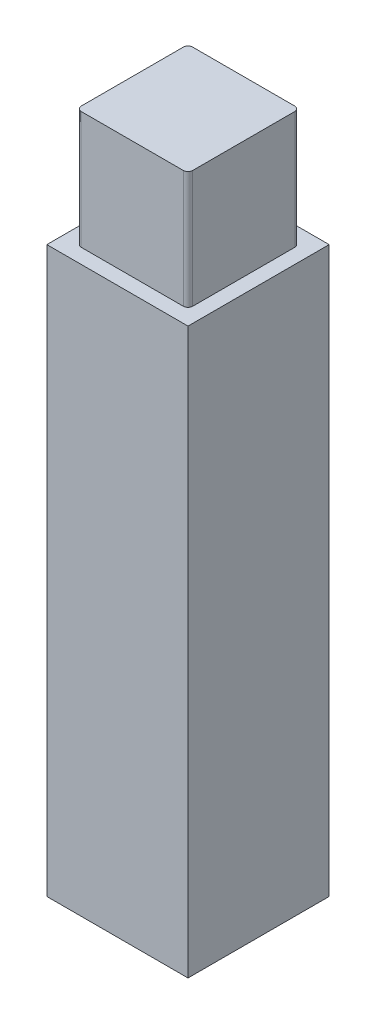
ISO-10303-21;
HEADER;
FILE_DESCRIPTION(('STEP AP214'),'2;1');
FILE_NAME('part.step','',(''),(''),'','','');
FILE_SCHEMA(('AUTOMOTIVE_DESIGN { 1 0 10303 214 1 1 1 1 }'));
ENDSEC;
DATA;
#1=APPLICATION_CONTEXT('core data for automotive mechanical design processes');
#2=APPLICATION_PROTOCOL_DEFINITION('international standard','automotive_design',2000,#1);
#3=PRODUCT_CONTEXT('',#1,'mechanical');
#4=PRODUCT('Part','Part','',(#3));
#5=PRODUCT_RELATED_PRODUCT_CATEGORY('part','',(#4));
#6=PRODUCT_DEFINITION_FORMATION('','',#4);
#7=PRODUCT_DEFINITION_CONTEXT('part definition',#1,'design');
#8=PRODUCT_DEFINITION('design','',#6,#7);
#9=PRODUCT_DEFINITION_SHAPE('','',#8);
#10=(LENGTH_UNIT() NAMED_UNIT(*) SI_UNIT(.MILLI.,.METRE.));
#11=(NAMED_UNIT(*) PLANE_ANGLE_UNIT() SI_UNIT($,.RADIAN.));
#12=(NAMED_UNIT(*) SI_UNIT($,.STERADIAN.) SOLID_ANGLE_UNIT());
#13=UNCERTAINTY_MEASURE_WITH_UNIT(LENGTH_MEASURE(1.E-05),#10,'distance_accuracy_value','');
#14=(GEOMETRIC_REPRESENTATION_CONTEXT(3) GLOBAL_UNCERTAINTY_ASSIGNED_CONTEXT((#13)) GLOBAL_UNIT_ASSIGNED_CONTEXT((#10,
#11,#12)) REPRESENTATION_CONTEXT('',''));
#15=CARTESIAN_POINT('',(0.,0.,0.));
#16=DIRECTION('',(0.,0.,1.));
#17=DIRECTION('',(1.,0.,0.));
#18=AXIS2_PLACEMENT_3D('',#15,#16,#17);
#19=CARTESIAN_POINT('',(15.,120.,-15.));
#20=DIRECTION('',(-1.,0.,0.));
#21=DIRECTION('',(0.,0.,1.));
#22=AXIS2_PLACEMENT_3D('',#19,#20,#21);
#23=PLANE('',#22);
#24=DIRECTION('',(0.,0.,-1.));
#25=VECTOR('',#24,1.);
#26=CARTESIAN_POINT('',(15.,0.,-15.));
#27=LINE('',#26,#25);
#28=CARTESIAN_POINT('',(15.,0.,15.));
#29=VERTEX_POINT('',#28);
#30=CARTESIAN_POINT('',(15.,0.,-15.));
#31=VERTEX_POINT('',#30);
#32=EDGE_CURVE('E209',#29,#31,#27,.T.);
#33=ORIENTED_EDGE('',*,*,#32,.T.);
#34=DIRECTION('',(0.,-1.,0.));
#35=VECTOR('',#34,1.);
#36=CARTESIAN_POINT('',(15.,120.,-15.));
#37=LINE('',#36,#35);
#38=CARTESIAN_POINT('',(15.,120.,-15.));
#39=VERTEX_POINT('',#38);
#40=EDGE_CURVE('E245',#39,#31,#37,.T.);
#41=ORIENTED_EDGE('',*,*,#40,.F.);
#42=DIRECTION('',(0.,0.,-1.));
#43=VECTOR('',#42,1.);
#44=CARTESIAN_POINT('',(15.,120.,-15.));
#45=LINE('',#44,#43);
#46=CARTESIAN_POINT('',(15.,120.,15.));
#47=VERTEX_POINT('',#46);
#48=EDGE_CURVE('E219',#47,#39,#45,.T.);
#49=ORIENTED_EDGE('',*,*,#48,.F.);
#50=DIRECTION('',(0.,-1.,0.));
#51=VECTOR('',#50,1.);
#52=CARTESIAN_POINT('',(15.,120.,15.));
#53=LINE('',#52,#51);
#54=EDGE_CURVE('E229',#47,#29,#53,.T.);
#55=ORIENTED_EDGE('',*,*,#54,.T.);
#56=EDGE_LOOP('',(#33,#41,#49,#55));
#57=FACE_BOUND('',#56,.T.);
#58=ADVANCED_FACE('F41',(#57),#23,.F.);
#59=CARTESIAN_POINT('',(-15.,120.,-15.));
#60=DIRECTION('',(0.,0.,1.));
#61=DIRECTION('',(1.,0.,0.));
#62=AXIS2_PLACEMENT_3D('',#59,#60,#61);
#63=PLANE('',#62);
#64=DIRECTION('',(-1.,0.,0.));
#65=VECTOR('',#64,1.);
#66=CARTESIAN_POINT('',(-15.,0.,-15.));
#67=LINE('',#66,#65);
#68=CARTESIAN_POINT('',(-15.,0.,-15.));
#69=VERTEX_POINT('',#68);
#70=EDGE_CURVE('E232',#31,#69,#67,.T.);
#71=ORIENTED_EDGE('',*,*,#70,.T.);
#72=DIRECTION('',(0.,-1.,0.));
#73=VECTOR('',#72,1.);
#74=CARTESIAN_POINT('',(-15.,120.,-15.));
#75=LINE('',#74,#73);
#76=CARTESIAN_POINT('',(-15.,120.,-15.));
#77=VERTEX_POINT('',#76);
#78=EDGE_CURVE('E242',#77,#69,#75,.T.);
#79=ORIENTED_EDGE('',*,*,#78,.F.);
#80=DIRECTION('',(-1.,0.,0.));
#81=VECTOR('',#80,1.);
#82=CARTESIAN_POINT('',(-15.,120.,-15.));
#83=LINE('',#82,#81);
#84=EDGE_CURVE('E222',#39,#77,#83,.T.);
#85=ORIENTED_EDGE('',*,*,#84,.F.);
#86=ORIENTED_EDGE('',*,*,#40,.T.);
#87=EDGE_LOOP('',(#71,#79,#85,#86));
#88=FACE_BOUND('',#87,.T.);
#89=ADVANCED_FACE('F320',(#88),#63,.F.);
#90=CARTESIAN_POINT('',(-15.,120.,-15.));
#91=DIRECTION('',(1.,0.,0.));
#92=DIRECTION('',(0.,0.,-1.));
#93=AXIS2_PLACEMENT_3D('',#90,#91,#92);
#94=PLANE('',#93);
#95=DIRECTION('',(0.,0.,1.));
#96=VECTOR('',#95,1.);
#97=CARTESIAN_POINT('',(-15.,0.,-15.));
#98=LINE('',#97,#96);
#99=CARTESIAN_POINT('',(-15.,0.,15.));
#100=VERTEX_POINT('',#99);
#101=EDGE_CURVE('E234',#69,#100,#98,.T.);
#102=ORIENTED_EDGE('',*,*,#101,.T.);
#103=DIRECTION('',(0.,-1.,0.));
#104=VECTOR('',#103,1.);
#105=CARTESIAN_POINT('',(-15.,120.,15.));
#106=LINE('',#105,#104);
#107=CARTESIAN_POINT('',(-15.,120.,15.));
#108=VERTEX_POINT('',#107);
#109=EDGE_CURVE('E239',#108,#100,#106,.T.);
#110=ORIENTED_EDGE('',*,*,#109,.F.);
#111=DIRECTION('',(0.,0.,1.));
#112=VECTOR('',#111,1.);
#113=CARTESIAN_POINT('',(-15.,120.,-15.));
#114=LINE('',#113,#112);
#115=EDGE_CURVE('E225',#77,#108,#114,.T.);
#116=ORIENTED_EDGE('',*,*,#115,.F.);
#117=ORIENTED_EDGE('',*,*,#78,.T.);
#118=EDGE_LOOP('',(#102,#110,#116,#117));
#119=FACE_BOUND('',#118,.T.);
#120=ADVANCED_FACE('F326',(#119),#94,.F.);
#121=CARTESIAN_POINT('',(-15.,120.,15.));
#122=DIRECTION('',(0.,0.,-1.));
#123=DIRECTION('',(-1.,0.,0.));
#124=AXIS2_PLACEMENT_3D('',#121,#122,#123);
#125=PLANE('',#124);
#126=DIRECTION('',(1.,0.,0.));
#127=VECTOR('',#126,1.);
#128=CARTESIAN_POINT('',(-15.,0.,15.));
#129=LINE('',#128,#127);
#130=EDGE_CURVE('E223',#100,#29,#129,.T.);
#131=ORIENTED_EDGE('',*,*,#130,.T.);
#132=ORIENTED_EDGE('',*,*,#54,.F.);
#133=DIRECTION('',(1.,0.,0.));
#134=VECTOR('',#133,1.);
#135=CARTESIAN_POINT('',(-15.,120.,15.));
#136=LINE('',#135,#134);
#137=EDGE_CURVE('E227',#108,#47,#136,.T.);
#138=ORIENTED_EDGE('',*,*,#137,.F.);
#139=ORIENTED_EDGE('',*,*,#109,.T.);
#140=EDGE_LOOP('',(#131,#132,#138,#139));
#141=FACE_BOUND('',#140,.T.);
#142=ADVANCED_FACE('F332',(#141),#125,.F.);
#143=CARTESIAN_POINT('',(0.,120.,0.));
#144=DIRECTION('',(0.,1.,0.));
#145=DIRECTION('',(0.,0.,1.));
#146=AXIS2_PLACEMENT_3D('',#143,#144,#145);
#147=PLANE('',#146);
#148=DIRECTION('',(0.,0.,-1.));
#149=VECTOR('',#148,1.);
#150=CARTESIAN_POINT('',(11.85,120.,-11.85));
#151=LINE('',#150,#149);
#152=CARTESIAN_POINT('',(11.85,120.,10.85));
#153=VERTEX_POINT('',#152);
#154=CARTESIAN_POINT('',(11.85,120.,-10.85));
#155=VERTEX_POINT('',#154);
#156=EDGE_CURVE('E192',#153,#155,#151,.T.);
#157=ORIENTED_EDGE('',*,*,#156,.F.);
#158=CARTESIAN_POINT('',(10.85,120.,10.85));
#159=DIRECTION('',(0.,1.,0.));
#160=DIRECTION('',(0.,0.,1.));
#161=AXIS2_PLACEMENT_3D('',#158,#159,#160);
#162=CIRCLE('',#161,1.);
#163=CARTESIAN_POINT('',(10.85,120.,11.85));
#164=VERTEX_POINT('',#163);
#165=EDGE_CURVE('E49',#153,#164,#162,.F.);
#166=ORIENTED_EDGE('',*,*,#165,.T.);
#167=DIRECTION('',(1.,0.,0.));
#168=VECTOR('',#167,1.);
#169=CARTESIAN_POINT('',(-11.85,120.,11.85));
#170=LINE('',#169,#168);
#171=CARTESIAN_POINT('',(-10.85,120.,11.85));
#172=VERTEX_POINT('',#171);
#173=EDGE_CURVE('E200',#172,#164,#170,.T.);
#174=ORIENTED_EDGE('',*,*,#173,.F.);
#175=CARTESIAN_POINT('',(-10.85,120.,10.85));
#176=DIRECTION('',(0.,1.,0.));
#177=DIRECTION('',(0.,0.,1.));
#178=AXIS2_PLACEMENT_3D('',#175,#176,#177);
#179=CIRCLE('',#178,1.);
#180=CARTESIAN_POINT('',(-11.85,120.,10.85));
#181=VERTEX_POINT('',#180);
#182=EDGE_CURVE('E277',#172,#181,#179,.F.);
#183=ORIENTED_EDGE('',*,*,#182,.T.);
#184=DIRECTION('',(0.,0.,1.));
#185=VECTOR('',#184,1.);
#186=CARTESIAN_POINT('',(-11.85,120.,-11.85));
#187=LINE('',#186,#185);
#188=CARTESIAN_POINT('',(-11.85,120.,-10.85));
#189=VERTEX_POINT('',#188);
#190=EDGE_CURVE('E214',#189,#181,#187,.T.);
#191=ORIENTED_EDGE('',*,*,#190,.F.);
#192=CARTESIAN_POINT('',(-10.85,120.,-10.85));
#193=DIRECTION('',(0.,1.,0.));
#194=DIRECTION('',(0.,0.,1.));
#195=AXIS2_PLACEMENT_3D('',#192,#193,#194);
#196=CIRCLE('',#195,1.);
#197=CARTESIAN_POINT('',(-10.85,120.,-11.85));
#198=VERTEX_POINT('',#197);
#199=EDGE_CURVE('E275',#189,#198,#196,.F.);
#200=ORIENTED_EDGE('',*,*,#199,.T.);
#201=DIRECTION('',(-1.,0.,0.));
#202=VECTOR('',#201,1.);
#203=CARTESIAN_POINT('',(-11.85,120.,-11.85));
#204=LINE('',#203,#202);
#205=CARTESIAN_POINT('',(10.85,120.,-11.85));
#206=VERTEX_POINT('',#205);
#207=EDGE_CURVE('E211',#206,#198,#204,.T.);
#208=ORIENTED_EDGE('',*,*,#207,.F.);
#209=CARTESIAN_POINT('',(10.85,120.,-10.85));
#210=DIRECTION('',(0.,1.,0.));
#211=DIRECTION('',(0.,0.,1.));
#212=AXIS2_PLACEMENT_3D('',#209,#210,#211);
#213=CIRCLE('',#212,1.);
#214=EDGE_CURVE('E11',#206,#155,#213,.F.);
#215=ORIENTED_EDGE('',*,*,#214,.T.);
#216=EDGE_LOOP('',(#157,#166,#174,#183,#191,#200,#208,#215));
#217=FACE_BOUND('',#216,.T.);
#218=ORIENTED_EDGE('',*,*,#48,.T.);
#219=ORIENTED_EDGE('',*,*,#84,.T.);
#220=ORIENTED_EDGE('',*,*,#115,.T.);
#221=ORIENTED_EDGE('',*,*,#137,.T.);
#222=EDGE_LOOP('',(#218,#219,#220,#221));
#223=FACE_BOUND('',#222,.T.);
#224=ADVANCED_FACE('F279',(#217,#223),#147,.T.);
#225=CARTESIAN_POINT('',(0.,0.,0.));
#226=DIRECTION('',(0.,1.,0.));
#227=DIRECTION('',(0.,0.,1.));
#228=AXIS2_PLACEMENT_3D('',#225,#226,#227);
#229=PLANE('',#228);
#230=DIRECTION('',(-1.,0.,0.));
#231=VECTOR('',#230,1.);
#232=CARTESIAN_POINT('',(-12.,0.,12.));
#233=LINE('',#232,#231);
#234=CARTESIAN_POINT('',(12.,0.,12.));
#235=VERTEX_POINT('',#234);
#236=CARTESIAN_POINT('',(-12.,0.,12.));
#237=VERTEX_POINT('',#236);
#238=EDGE_CURVE('E186',#235,#237,#233,.T.);
#239=ORIENTED_EDGE('',*,*,#238,.F.);
#240=DIRECTION('',(0.,0.,1.));
#241=VECTOR('',#240,1.);
#242=CARTESIAN_POINT('',(12.,0.,12.));
#243=LINE('',#242,#241);
#244=CARTESIAN_POINT('',(12.,0.,-12.));
#245=VERTEX_POINT('',#244);
#246=EDGE_CURVE('E160',#245,#235,#243,.T.);
#247=ORIENTED_EDGE('',*,*,#246,.F.);
#248=DIRECTION('',(1.,0.,0.));
#249=VECTOR('',#248,1.);
#250=CARTESIAN_POINT('',(-12.,0.,-12.));
#251=LINE('',#250,#249);
#252=CARTESIAN_POINT('',(-12.,0.,-12.));
#253=VERTEX_POINT('',#252);
#254=EDGE_CURVE('E177',#253,#245,#251,.T.);
#255=ORIENTED_EDGE('',*,*,#254,.F.);
#256=DIRECTION('',(0.,0.,-1.));
#257=VECTOR('',#256,1.);
#258=CARTESIAN_POINT('',(-12.,0.,12.));
#259=LINE('',#258,#257);
#260=EDGE_CURVE('E180',#237,#253,#259,.T.);
#261=ORIENTED_EDGE('',*,*,#260,.F.);
#262=EDGE_LOOP('',(#239,#247,#255,#261));
#263=FACE_BOUND('',#262,.T.);
#264=ORIENTED_EDGE('',*,*,#32,.F.);
#265=ORIENTED_EDGE('',*,*,#130,.F.);
#266=ORIENTED_EDGE('',*,*,#101,.F.);
#267=ORIENTED_EDGE('',*,*,#70,.F.);
#268=EDGE_LOOP('',(#264,#265,#266,#267));
#269=FACE_BOUND('',#268,.T.);
#270=ADVANCED_FACE('F337',(#263,#269),#229,.F.);
#271=CARTESIAN_POINT('',(11.85,145.,-11.85));
#272=DIRECTION('',(-1.,0.,0.));
#273=DIRECTION('',(0.,0.,1.));
#274=AXIS2_PLACEMENT_3D('',#271,#272,#273);
#275=PLANE('',#274);
#276=DIRECTION('',(0.,0.,-1.));
#277=VECTOR('',#276,1.);
#278=CARTESIAN_POINT('',(11.85,145.,-11.85));
#279=LINE('',#278,#277);
#280=CARTESIAN_POINT('',(11.85,145.,10.85));
#281=VERTEX_POINT('',#280);
#282=CARTESIAN_POINT('',(11.85,145.,-10.85));
#283=VERTEX_POINT('',#282);
#284=EDGE_CURVE('E196',#281,#283,#279,.T.);
#285=ORIENTED_EDGE('',*,*,#284,.F.);
#286=DIRECTION('',(0.,-1.,0.));
#287=VECTOR('',#286,1.);
#288=CARTESIAN_POINT('',(11.85,145.,10.85));
#289=LINE('',#288,#287);
#290=EDGE_CURVE('E273',#281,#153,#289,.T.);
#291=ORIENTED_EDGE('',*,*,#290,.T.);
#292=ORIENTED_EDGE('',*,*,#156,.T.);
#293=DIRECTION('',(0.,-1.,0.));
#294=VECTOR('',#293,1.);
#295=CARTESIAN_POINT('',(11.85,145.,-10.85));
#296=LINE('',#295,#294);
#297=EDGE_CURVE('E271',#155,#283,#296,.F.);
#298=ORIENTED_EDGE('',*,*,#297,.T.);
#299=EDGE_LOOP('',(#285,#291,#292,#298));
#300=FACE_BOUND('',#299,.T.);
#301=ADVANCED_FACE('F292',(#300),#275,.F.);
#302=CARTESIAN_POINT('',(-11.85,145.,-11.85));
#303=DIRECTION('',(0.,0.,1.));
#304=DIRECTION('',(1.,0.,0.));
#305=AXIS2_PLACEMENT_3D('',#302,#303,#304);
#306=PLANE('',#305);
#307=ORIENTED_EDGE('',*,*,#207,.T.);
#308=DIRECTION('',(0.,-1.,0.));
#309=VECTOR('',#308,1.);
#310=CARTESIAN_POINT('',(-10.85,145.,-11.85));
#311=LINE('',#310,#309);
#312=CARTESIAN_POINT('',(-10.85,145.,-11.85));
#313=VERTEX_POINT('',#312);
#314=EDGE_CURVE('E256',#198,#313,#311,.F.);
#315=ORIENTED_EDGE('',*,*,#314,.T.);
#316=DIRECTION('',(-1.,0.,0.));
#317=VECTOR('',#316,1.);
#318=CARTESIAN_POINT('',(-11.85,145.,-11.85));
#319=LINE('',#318,#317);
#320=CARTESIAN_POINT('',(10.85,145.,-11.85));
#321=VERTEX_POINT('',#320);
#322=EDGE_CURVE('E199',#321,#313,#319,.T.);
#323=ORIENTED_EDGE('',*,*,#322,.F.);
#324=DIRECTION('',(0.,-1.,0.));
#325=VECTOR('',#324,1.);
#326=CARTESIAN_POINT('',(10.85,145.,-11.85));
#327=LINE('',#326,#325);
#328=EDGE_CURVE('E253',#321,#206,#327,.T.);
#329=ORIENTED_EDGE('',*,*,#328,.T.);
#330=EDGE_LOOP('',(#307,#315,#323,#329));
#331=FACE_BOUND('',#330,.T.);
#332=ADVANCED_FACE('F299',(#331),#306,.F.);
#333=CARTESIAN_POINT('',(-11.85,145.,-11.85));
#334=DIRECTION('',(1.,0.,0.));
#335=DIRECTION('',(0.,0.,-1.));
#336=AXIS2_PLACEMENT_3D('',#333,#334,#335);
#337=PLANE('',#336);
#338=DIRECTION('',(0.,0.,1.));
#339=VECTOR('',#338,1.);
#340=CARTESIAN_POINT('',(-11.85,145.,-11.85));
#341=LINE('',#340,#339);
#342=CARTESIAN_POINT('',(-11.85,145.,-10.85));
#343=VERTEX_POINT('',#342);
#344=CARTESIAN_POINT('',(-11.85,145.,10.85));
#345=VERTEX_POINT('',#344);
#346=EDGE_CURVE('E203',#343,#345,#341,.T.);
#347=ORIENTED_EDGE('',*,*,#346,.F.);
#348=DIRECTION('',(0.,-1.,0.));
#349=VECTOR('',#348,1.);
#350=CARTESIAN_POINT('',(-11.85,145.,-10.85));
#351=LINE('',#350,#349);
#352=EDGE_CURVE('E250',#343,#189,#351,.T.);
#353=ORIENTED_EDGE('',*,*,#352,.T.);
#354=ORIENTED_EDGE('',*,*,#190,.T.);
#355=DIRECTION('',(0.,-1.,0.));
#356=VECTOR('',#355,1.);
#357=CARTESIAN_POINT('',(-11.85,145.,10.85));
#358=LINE('',#357,#356);
#359=EDGE_CURVE('E248',#181,#345,#358,.F.);
#360=ORIENTED_EDGE('',*,*,#359,.T.);
#361=EDGE_LOOP('',(#347,#353,#354,#360));
#362=FACE_BOUND('',#361,.T.);
#363=ADVANCED_FACE('F307',(#362),#337,.F.);
#364=CARTESIAN_POINT('',(-11.85,145.,11.85));
#365=DIRECTION('',(0.,0.,-1.));
#366=DIRECTION('',(-1.,0.,0.));
#367=AXIS2_PLACEMENT_3D('',#364,#365,#366);
#368=PLANE('',#367);
#369=DIRECTION('',(1.,0.,0.));
#370=VECTOR('',#369,1.);
#371=CARTESIAN_POINT('',(-11.85,145.,11.85));
#372=LINE('',#371,#370);
#373=CARTESIAN_POINT('',(-10.85,145.,11.85));
#374=VERTEX_POINT('',#373);
#375=CARTESIAN_POINT('',(10.85,145.,11.85));
#376=VERTEX_POINT('',#375);
#377=EDGE_CURVE('E206',#374,#376,#372,.T.);
#378=ORIENTED_EDGE('',*,*,#377,.F.);
#379=DIRECTION('',(0.,-1.,0.));
#380=VECTOR('',#379,1.);
#381=CARTESIAN_POINT('',(-10.85,145.,11.85));
#382=LINE('',#381,#380);
#383=EDGE_CURVE('E268',#374,#172,#382,.T.);
#384=ORIENTED_EDGE('',*,*,#383,.T.);
#385=ORIENTED_EDGE('',*,*,#173,.T.);
#386=DIRECTION('',(0.,-1.,0.));
#387=VECTOR('',#386,1.);
#388=CARTESIAN_POINT('',(10.85,145.,11.85));
#389=LINE('',#388,#387);
#390=EDGE_CURVE('E266',#164,#376,#389,.F.);
#391=ORIENTED_EDGE('',*,*,#390,.T.);
#392=EDGE_LOOP('',(#378,#384,#385,#391));
#393=FACE_BOUND('',#392,.T.);
#394=ADVANCED_FACE('F283',(#393),#368,.F.);
#395=CARTESIAN_POINT('',(0.,145.,0.));
#396=DIRECTION('',(0.,1.,0.));
#397=DIRECTION('',(0.,0.,1.));
#398=AXIS2_PLACEMENT_3D('',#395,#396,#397);
#399=PLANE('',#398);
#400=ORIENTED_EDGE('',*,*,#322,.T.);
#401=CARTESIAN_POINT('',(-10.85,145.,-10.85));
#402=DIRECTION('',(0.,1.,0.));
#403=DIRECTION('',(0.,0.,1.));
#404=AXIS2_PLACEMENT_3D('',#401,#402,#403);
#405=CIRCLE('',#404,1.);
#406=EDGE_CURVE('E264',#313,#343,#405,.T.);
#407=ORIENTED_EDGE('',*,*,#406,.T.);
#408=ORIENTED_EDGE('',*,*,#346,.T.);
#409=CARTESIAN_POINT('',(-10.85,145.,10.85));
#410=DIRECTION('',(0.,1.,0.));
#411=DIRECTION('',(0.,0.,1.));
#412=AXIS2_PLACEMENT_3D('',#409,#410,#411);
#413=CIRCLE('',#412,1.);
#414=EDGE_CURVE('E262',#345,#374,#413,.T.);
#415=ORIENTED_EDGE('',*,*,#414,.T.);
#416=ORIENTED_EDGE('',*,*,#377,.T.);
#417=CARTESIAN_POINT('',(10.85,145.,10.85));
#418=DIRECTION('',(0.,1.,0.));
#419=DIRECTION('',(0.,0.,1.));
#420=AXIS2_PLACEMENT_3D('',#417,#418,#419);
#421=CIRCLE('',#420,1.);
#422=EDGE_CURVE('E260',#376,#281,#421,.T.);
#423=ORIENTED_EDGE('',*,*,#422,.T.);
#424=ORIENTED_EDGE('',*,*,#284,.T.);
#425=CARTESIAN_POINT('',(10.85,145.,-10.85));
#426=DIRECTION('',(0.,1.,0.));
#427=DIRECTION('',(0.,0.,1.));
#428=AXIS2_PLACEMENT_3D('',#425,#426,#427);
#429=CIRCLE('',#428,1.);
#430=EDGE_CURVE('E258',#283,#321,#429,.T.);
#431=ORIENTED_EDGE('',*,*,#430,.T.);
#432=EDGE_LOOP('',(#400,#407,#408,#415,#416,#423,#424,#431));
#433=FACE_BOUND('',#432,.T.);
#434=ADVANCED_FACE('F289',(#433),#399,.T.);
#435=CARTESIAN_POINT('',(12.,26.,12.));
#436=DIRECTION('',(1.,0.,0.));
#437=DIRECTION('',(0.,0.,-1.));
#438=AXIS2_PLACEMENT_3D('',#435,#436,#437);
#439=PLANE('',#438);
#440=ORIENTED_EDGE('',*,*,#246,.T.);
#441=DIRECTION('',(0.,-1.,0.));
#442=VECTOR('',#441,1.);
#443=CARTESIAN_POINT('',(12.,26.,12.));
#444=LINE('',#443,#442);
#445=CARTESIAN_POINT('',(12.,26.,12.));
#446=VERTEX_POINT('',#445);
#447=EDGE_CURVE('E153',#446,#235,#444,.T.);
#448=ORIENTED_EDGE('',*,*,#447,.F.);
#449=DIRECTION('',(0.,0.,1.));
#450=VECTOR('',#449,1.);
#451=CARTESIAN_POINT('',(12.,26.,12.));
#452=LINE('',#451,#450);
#453=CARTESIAN_POINT('',(12.,26.,-12.));
#454=VERTEX_POINT('',#453);
#455=EDGE_CURVE('E157',#454,#446,#452,.T.);
#456=ORIENTED_EDGE('',*,*,#455,.F.);
#457=DIRECTION('',(0.,-1.,0.));
#458=VECTOR('',#457,1.);
#459=CARTESIAN_POINT('',(12.,26.,-12.));
#460=LINE('',#459,#458);
#461=EDGE_CURVE('E190',#454,#245,#460,.T.);
#462=ORIENTED_EDGE('',*,*,#461,.T.);
#463=EDGE_LOOP('',(#440,#448,#456,#462));
#464=FACE_BOUND('',#463,.T.);
#465=ADVANCED_FACE('F155',(#464),#439,.F.);
#466=CARTESIAN_POINT('',(-12.,26.,-12.));
#467=DIRECTION('',(0.,0.,-1.));
#468=DIRECTION('',(-1.,0.,0.));
#469=AXIS2_PLACEMENT_3D('',#466,#467,#468);
#470=PLANE('',#469);
#471=ORIENTED_EDGE('',*,*,#254,.T.);
#472=ORIENTED_EDGE('',*,*,#461,.F.);
#473=DIRECTION('',(1.,0.,0.));
#474=VECTOR('',#473,1.);
#475=CARTESIAN_POINT('',(-12.,26.,-12.));
#476=LINE('',#475,#474);
#477=CARTESIAN_POINT('',(-12.,26.,-12.));
#478=VERTEX_POINT('',#477);
#479=EDGE_CURVE('E165',#478,#454,#476,.T.);
#480=ORIENTED_EDGE('',*,*,#479,.F.);
#481=DIRECTION('',(0.,-1.,0.));
#482=VECTOR('',#481,1.);
#483=CARTESIAN_POINT('',(-12.,26.,-12.));
#484=LINE('',#483,#482);
#485=EDGE_CURVE('E193',#478,#253,#484,.T.);
#486=ORIENTED_EDGE('',*,*,#485,.T.);
#487=EDGE_LOOP('',(#471,#472,#480,#486));
#488=FACE_BOUND('',#487,.T.);
#489=ADVANCED_FACE('F355',(#488),#470,.F.);
#490=CARTESIAN_POINT('',(-12.,26.,12.));
#491=DIRECTION('',(-1.,0.,0.));
#492=DIRECTION('',(0.,0.,1.));
#493=AXIS2_PLACEMENT_3D('',#490,#491,#492);
#494=PLANE('',#493);
#495=ORIENTED_EDGE('',*,*,#260,.T.);
#496=ORIENTED_EDGE('',*,*,#485,.F.);
#497=DIRECTION('',(0.,0.,-1.));
#498=VECTOR('',#497,1.);
#499=CARTESIAN_POINT('',(-12.,26.,12.));
#500=LINE('',#499,#498);
#501=CARTESIAN_POINT('',(-12.,26.,12.));
#502=VERTEX_POINT('',#501);
#503=EDGE_CURVE('E173',#502,#478,#500,.T.);
#504=ORIENTED_EDGE('',*,*,#503,.F.);
#505=DIRECTION('',(0.,-1.,0.));
#506=VECTOR('',#505,1.);
#507=CARTESIAN_POINT('',(-12.,26.,12.));
#508=LINE('',#507,#506);
#509=EDGE_CURVE('E164',#502,#237,#508,.T.);
#510=ORIENTED_EDGE('',*,*,#509,.T.);
#511=EDGE_LOOP('',(#495,#496,#504,#510));
#512=FACE_BOUND('',#511,.T.);
#513=ADVANCED_FACE('F358',(#512),#494,.F.);
#514=CARTESIAN_POINT('',(-12.,26.,12.));
#515=DIRECTION('',(0.,0.,1.));
#516=DIRECTION('',(1.,0.,0.));
#517=AXIS2_PLACEMENT_3D('',#514,#515,#516);
#518=PLANE('',#517);
#519=ORIENTED_EDGE('',*,*,#238,.T.);
#520=ORIENTED_EDGE('',*,*,#509,.F.);
#521=DIRECTION('',(-1.,0.,0.));
#522=VECTOR('',#521,1.);
#523=CARTESIAN_POINT('',(-12.,26.,12.));
#524=LINE('',#523,#522);
#525=EDGE_CURVE('E168',#446,#502,#524,.T.);
#526=ORIENTED_EDGE('',*,*,#525,.F.);
#527=ORIENTED_EDGE('',*,*,#447,.T.);
#528=EDGE_LOOP('',(#519,#520,#526,#527));
#529=FACE_BOUND('',#528,.T.);
#530=ADVANCED_FACE('F169',(#529),#518,.F.);
#531=CARTESIAN_POINT('',(0.,26.,0.));
#532=DIRECTION('',(0.,-1.,0.));
#533=DIRECTION('',(0.,0.,-1.));
#534=AXIS2_PLACEMENT_3D('',#531,#532,#533);
#535=PLANE('',#534);
#536=ORIENTED_EDGE('',*,*,#455,.T.);
#537=ORIENTED_EDGE('',*,*,#525,.T.);
#538=ORIENTED_EDGE('',*,*,#503,.T.);
#539=ORIENTED_EDGE('',*,*,#479,.T.);
#540=EDGE_LOOP('',(#536,#537,#538,#539));
#541=FACE_BOUND('',#540,.T.);
#542=ADVANCED_FACE('F175',(#541),#535,.T.);
#543=CARTESIAN_POINT('',(-10.85,145.,-10.85));
#544=DIRECTION('',(0.,-1.,0.));
#545=DIRECTION('',(0.,0.,-1.));
#546=AXIS2_PLACEMENT_3D('',#543,#544,#545);
#547=CYLINDRICAL_SURFACE('',#546,1.);
#548=ORIENTED_EDGE('',*,*,#406,.F.);
#549=ORIENTED_EDGE('',*,*,#314,.F.);
#550=ORIENTED_EDGE('',*,*,#199,.F.);
#551=ORIENTED_EDGE('',*,*,#352,.F.);
#552=EDGE_LOOP('',(#548,#549,#550,#551));
#553=FACE_BOUND('',#552,.T.);
#554=ADVANCED_FACE('F302',(#553),#547,.T.);
#555=CARTESIAN_POINT('',(-10.85,145.,10.85));
#556=DIRECTION('',(0.,-1.,0.));
#557=DIRECTION('',(0.,0.,-1.));
#558=AXIS2_PLACEMENT_3D('',#555,#556,#557);
#559=CYLINDRICAL_SURFACE('',#558,1.);
#560=ORIENTED_EDGE('',*,*,#414,.F.);
#561=ORIENTED_EDGE('',*,*,#359,.F.);
#562=ORIENTED_EDGE('',*,*,#182,.F.);
#563=ORIENTED_EDGE('',*,*,#383,.F.);
#564=EDGE_LOOP('',(#560,#561,#562,#563));
#565=FACE_BOUND('',#564,.T.);
#566=ADVANCED_FACE('F311',(#565),#559,.T.);
#567=CARTESIAN_POINT('',(10.85,145.,10.85));
#568=DIRECTION('',(0.,-1.,0.));
#569=DIRECTION('',(0.,0.,-1.));
#570=AXIS2_PLACEMENT_3D('',#567,#568,#569);
#571=CYLINDRICAL_SURFACE('',#570,1.);
#572=ORIENTED_EDGE('',*,*,#422,.F.);
#573=ORIENTED_EDGE('',*,*,#390,.F.);
#574=ORIENTED_EDGE('',*,*,#165,.F.);
#575=ORIENTED_EDGE('',*,*,#290,.F.);
#576=EDGE_LOOP('',(#572,#573,#574,#575));
#577=FACE_BOUND('',#576,.T.);
#578=ADVANCED_FACE('F286',(#577),#571,.T.);
#579=CARTESIAN_POINT('',(10.85,145.,-10.85));
#580=DIRECTION('',(0.,-1.,0.));
#581=DIRECTION('',(0.,0.,-1.));
#582=AXIS2_PLACEMENT_3D('',#579,#580,#581);
#583=CYLINDRICAL_SURFACE('',#582,1.);
#584=ORIENTED_EDGE('',*,*,#430,.F.);
#585=ORIENTED_EDGE('',*,*,#297,.F.);
#586=ORIENTED_EDGE('',*,*,#214,.F.);
#587=ORIENTED_EDGE('',*,*,#328,.F.);
#588=EDGE_LOOP('',(#584,#585,#586,#587));
#589=FACE_BOUND('',#588,.T.);
#590=ADVANCED_FACE('F43',(#589),#583,.T.);
#591=CLOSED_SHELL('',(#58,#89,#120,#142,#224,#270,#301,#332,#363,#394,#434,#465,#489,#513,#530,
#542,#554,#566,#578,#590));
#592=MANIFOLD_SOLID_BREP('B2',#591);
#593=ADVANCED_BREP_SHAPE_REPRESENTATION('',(#18,#592),#14);
#594=SHAPE_DEFINITION_REPRESENTATION(#9,#593);
ENDSEC;
END-ISO-10303-21;
